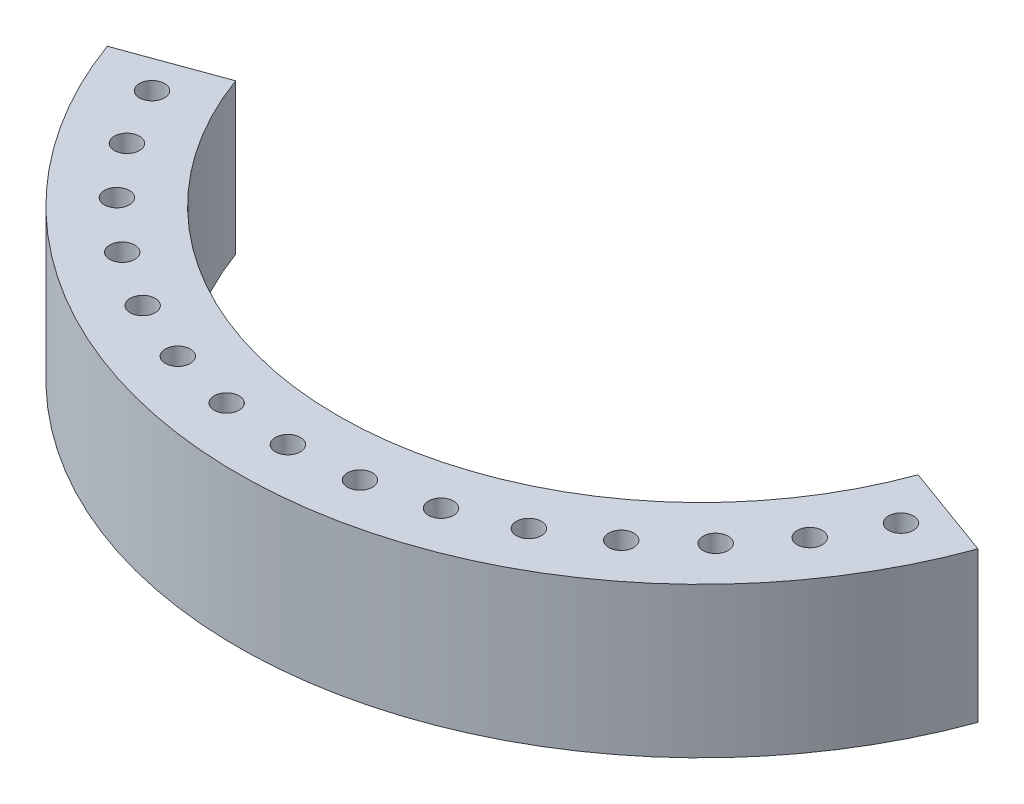
ISO-10303-21;
HEADER;
FILE_DESCRIPTION(('STEP AP214'),'2;1');
FILE_NAME('part.step','',(''),(''),'','','');
FILE_SCHEMA(('AUTOMOTIVE_DESIGN { 1 0 10303 214 1 1 1 1 }'));
ENDSEC;
DATA;
#1=APPLICATION_CONTEXT('core data for automotive mechanical design processes');
#2=APPLICATION_PROTOCOL_DEFINITION('international standard','automotive_design',2000,#1);
#3=PRODUCT_CONTEXT('',#1,'mechanical');
#4=PRODUCT('Part','Part','',(#3));
#5=PRODUCT_RELATED_PRODUCT_CATEGORY('part','',(#4));
#6=PRODUCT_DEFINITION_FORMATION('','',#4);
#7=PRODUCT_DEFINITION_CONTEXT('part definition',#1,'design');
#8=PRODUCT_DEFINITION('design','',#6,#7);
#9=PRODUCT_DEFINITION_SHAPE('','',#8);
#10=(LENGTH_UNIT() NAMED_UNIT(*) SI_UNIT(.MILLI.,.METRE.));
#11=(NAMED_UNIT(*) PLANE_ANGLE_UNIT() SI_UNIT($,.RADIAN.));
#12=(NAMED_UNIT(*) SI_UNIT($,.STERADIAN.) SOLID_ANGLE_UNIT());
#13=UNCERTAINTY_MEASURE_WITH_UNIT(LENGTH_MEASURE(1.E-05),#10,'distance_accuracy_value','');
#14=(GEOMETRIC_REPRESENTATION_CONTEXT(3) GLOBAL_UNCERTAINTY_ASSIGNED_CONTEXT((#13)) GLOBAL_UNIT_ASSIGNED_CONTEXT((#10,
#11,#12)) REPRESENTATION_CONTEXT('',''));
#15=CARTESIAN_POINT('',(0.,0.,0.));
#16=DIRECTION('',(0.,0.,1.));
#17=DIRECTION('',(1.,0.,0.));
#18=AXIS2_PLACEMENT_3D('',#15,#16,#17);
#19=CARTESIAN_POINT('',(0.,-38.1,0.));
#20=DIRECTION('',(0.,1.,0.));
#21=DIRECTION('',(0.,0.,1.));
#22=AXIS2_PLACEMENT_3D('',#19,#20,#21);
#23=CYLINDRICAL_SURFACE('',#22,117.475);
#24=CARTESIAN_POINT('',(0.,0.,0.));
#25=DIRECTION('',(0.,1.,0.));
#26=DIRECTION('',(0.,0.,1.));
#27=AXIS2_PLACEMENT_3D('',#24,#25,#26);
#28=CIRCLE('',#27,117.475);
#29=CARTESIAN_POINT('',(-110.390390626825,0.,40.178816337183));
#30=VERTEX_POINT('',#29);
#31=CARTESIAN_POINT('',(110.390390626825,0.,40.178816337183));
#32=VERTEX_POINT('',#31);
#33=EDGE_CURVE('E98',#30,#32,#28,.T.);
#34=ORIENTED_EDGE('',*,*,#33,.F.);
#35=DIRECTION('',(0.,1.,0.));
#36=VECTOR('',#35,1.);
#37=CARTESIAN_POINT('',(-110.390390626825,-38.1,40.178816337183));
#38=LINE('',#37,#36);
#39=CARTESIAN_POINT('',(-110.390390626825,-38.1,40.178816337183));
#40=VERTEX_POINT('',#39);
#41=EDGE_CURVE('E11',#40,#30,#38,.T.);
#42=ORIENTED_EDGE('',*,*,#41,.F.);
#43=CARTESIAN_POINT('',(0.,-38.1,0.));
#44=DIRECTION('',(0.,1.,0.));
#45=DIRECTION('',(0.,0.,1.));
#46=AXIS2_PLACEMENT_3D('',#43,#44,#45);
#47=CIRCLE('',#46,117.475);
#48=CARTESIAN_POINT('',(110.390390626825,-38.1,40.178816337183));
#49=VERTEX_POINT('',#48);
#50=EDGE_CURVE('E91',#40,#49,#47,.T.);
#51=ORIENTED_EDGE('',*,*,#50,.T.);
#52=DIRECTION('',(0.,1.,0.));
#53=VECTOR('',#52,1.);
#54=CARTESIAN_POINT('',(110.390390626825,-38.1,40.178816337183));
#55=LINE('',#54,#53);
#56=EDGE_CURVE('E36',#49,#32,#55,.T.);
#57=ORIENTED_EDGE('',*,*,#56,.T.);
#58=EDGE_LOOP('',(#34,#42,#51,#57));
#59=FACE_BOUND('',#58,.T.);
#60=ADVANCED_FACE('F33',(#59),#23,.T.);
#61=CARTESIAN_POINT('',(-110.390390626825,-38.1,40.178816337183));
#62=DIRECTION('',(-0.342020143325669,0.,-0.939692620785908));
#63=DIRECTION('',(-0.939692620785908,0.,0.342020143325669));
#64=AXIS2_PLACEMENT_3D('',#61,#62,#63);
#65=PLANE('',#64);
#66=DIRECTION('',(-0.939692620785908,0.,0.342020143325669));
#67=VECTOR('',#66,1.);
#68=CARTESIAN_POINT('',(-110.390390626825,0.,40.178816337183));
#69=LINE('',#68,#67);
#70=CARTESIAN_POINT('',(-86.5221980588625,0.,31.491504696711));
#71=VERTEX_POINT('',#70);
#72=EDGE_CURVE('E93',#71,#30,#69,.T.);
#73=ORIENTED_EDGE('',*,*,#72,.F.);
#74=DIRECTION('',(0.,1.,0.));
#75=VECTOR('',#74,1.);
#76=CARTESIAN_POINT('',(-86.5221980588625,-38.1,31.491504696711));
#77=LINE('',#76,#75);
#78=CARTESIAN_POINT('',(-86.5221980588625,-38.1,31.491504696711));
#79=VERTEX_POINT('',#78);
#80=EDGE_CURVE('E42',#79,#71,#77,.T.);
#81=ORIENTED_EDGE('',*,*,#80,.F.);
#82=DIRECTION('',(-0.939692620785908,0.,0.342020143325669));
#83=VECTOR('',#82,1.);
#84=CARTESIAN_POINT('',(-110.390390626825,-38.1,40.178816337183));
#85=LINE('',#84,#83);
#86=EDGE_CURVE('E88',#79,#40,#85,.T.);
#87=ORIENTED_EDGE('',*,*,#86,.T.);
#88=ORIENTED_EDGE('',*,*,#41,.T.);
#89=EDGE_LOOP('',(#73,#81,#87,#88));
#90=FACE_BOUND('',#89,.T.);
#91=ADVANCED_FACE('F109',(#90),#65,.T.);
#92=CARTESIAN_POINT('',(0.,-38.1,0.));
#93=DIRECTION('',(0.,1.,0.));
#94=DIRECTION('',(0.,0.,1.));
#95=AXIS2_PLACEMENT_3D('',#92,#93,#94);
#96=CYLINDRICAL_SURFACE('',#95,92.075);
#97=CARTESIAN_POINT('',(0.,0.,0.));
#98=DIRECTION('',(0.,-1.,0.));
#99=DIRECTION('',(0.,0.,1.));
#100=AXIS2_PLACEMENT_3D('',#97,#98,#99);
#101=CIRCLE('',#100,92.075);
#102=CARTESIAN_POINT('',(86.5221980588625,0.,31.491504696711));
#103=VERTEX_POINT('',#102);
#104=EDGE_CURVE('E83',#103,#71,#101,.T.);
#105=ORIENTED_EDGE('',*,*,#104,.F.);
#106=DIRECTION('',(0.,1.,0.));
#107=VECTOR('',#106,1.);
#108=CARTESIAN_POINT('',(86.5221980588625,-38.1,31.491504696711));
#109=LINE('',#108,#107);
#110=CARTESIAN_POINT('',(86.5221980588625,-38.1,31.491504696711));
#111=VERTEX_POINT('',#110);
#112=EDGE_CURVE('E78',#111,#103,#109,.T.);
#113=ORIENTED_EDGE('',*,*,#112,.F.);
#114=CARTESIAN_POINT('',(0.,-38.1,0.));
#115=DIRECTION('',(0.,-1.,0.));
#116=DIRECTION('',(0.,0.,1.));
#117=AXIS2_PLACEMENT_3D('',#114,#115,#116);
#118=CIRCLE('',#117,92.075);
#119=EDGE_CURVE('E81',#111,#79,#118,.T.);
#120=ORIENTED_EDGE('',*,*,#119,.T.);
#121=ORIENTED_EDGE('',*,*,#80,.T.);
#122=EDGE_LOOP('',(#105,#113,#120,#121));
#123=FACE_BOUND('',#122,.T.);
#124=ADVANCED_FACE('F80',(#123),#96,.F.);
#125=CARTESIAN_POINT('',(86.5221980588625,-38.1,31.491504696711));
#126=DIRECTION('',(0.34202014332567,0.,-0.939692620785908));
#127=DIRECTION('',(-0.939692620785908,0.,-0.34202014332567));
#128=AXIS2_PLACEMENT_3D('',#125,#126,#127);
#129=PLANE('',#128);
#130=DIRECTION('',(-0.939692620785908,0.,-0.34202014332567));
#131=VECTOR('',#130,1.);
#132=CARTESIAN_POINT('',(86.5221980588625,0.,31.491504696711));
#133=LINE('',#132,#131);
#134=EDGE_CURVE('E101',#32,#103,#133,.T.);
#135=ORIENTED_EDGE('',*,*,#134,.F.);
#136=ORIENTED_EDGE('',*,*,#56,.F.);
#137=DIRECTION('',(-0.939692620785908,0.,-0.34202014332567));
#138=VECTOR('',#137,1.);
#139=CARTESIAN_POINT('',(86.5221980588625,-38.1,31.491504696711));
#140=LINE('',#139,#138);
#141=EDGE_CURVE('E87',#49,#111,#140,.T.);
#142=ORIENTED_EDGE('',*,*,#141,.T.);
#143=ORIENTED_EDGE('',*,*,#112,.T.);
#144=EDGE_LOOP('',(#135,#136,#142,#143));
#145=FACE_BOUND('',#144,.T.);
#146=ADVANCED_FACE('F90',(#145),#129,.T.);
#147=CARTESIAN_POINT('',(0.,-38.1,0.));
#148=DIRECTION('',(0.,1.,0.));
#149=DIRECTION('',(0.,0.,1.));
#150=AXIS2_PLACEMENT_3D('',#147,#148,#149);
#151=PLANE('',#150);
#152=CARTESIAN_POINT('',(94.9583983867651,-38.1,44.2798283738815));
#153=DIRECTION('',(0.,1.,0.));
#154=DIRECTION('',(0.,0.,1.));
#155=AXIS2_PLACEMENT_3D('',#152,#153,#154);
#156=CIRCLE('',#155,3.175);
#157=CARTESIAN_POINT('',(94.9583983867651,-38.1,47.4548283738815));
#158=VERTEX_POINT('',#157);
#159=EDGE_CURVE('E194',#158,#158,#156,.T.);
#160=ORIENTED_EDGE('',*,*,#159,.T.);
#161=EDGE_LOOP('',(#160));
#162=FACE_BOUND('',#161,.T.);
#163=CARTESIAN_POINT('',(86.5691675789585,-38.1,59.0218590836158));
#164=DIRECTION('',(0.,1.,0.));
#165=DIRECTION('',(0.,0.,1.));
#166=AXIS2_PLACEMENT_3D('',#163,#164,#165);
#167=CIRCLE('',#166,3.175);
#168=CARTESIAN_POINT('',(86.5691675789585,-38.1,62.1968590836158));
#169=VERTEX_POINT('',#168);
#170=EDGE_CURVE('E204',#169,#169,#167,.T.);
#171=ORIENTED_EDGE('',*,*,#170,.T.);
#172=EDGE_LOOP('',(#171));
#173=FACE_BOUND('',#172,.T.);
#174=CARTESIAN_POINT('',(75.9111283665304,-38.1,72.2170424146554));
#175=DIRECTION('',(0.,1.,0.));
#176=DIRECTION('',(0.,0.,1.));
#177=AXIS2_PLACEMENT_3D('',#174,#175,#176);
#178=CIRCLE('',#177,3.175);
#179=CARTESIAN_POINT('',(75.9111283665304,-38.1,75.3920424146554));
#180=VERTEX_POINT('',#179);
#181=EDGE_CURVE('E210',#180,#180,#178,.T.);
#182=ORIENTED_EDGE('',*,*,#181,.T.);
#183=EDGE_LOOP('',(#182));
#184=FACE_BOUND('',#183,.T.);
#185=CARTESIAN_POINT('',(63.263607091852,-38.1,83.5195584442816));
#186=DIRECTION('',(0.,1.,0.));
#187=DIRECTION('',(0.,0.,1.));
#188=AXIS2_PLACEMENT_3D('',#185,#186,#187);
#189=CIRCLE('',#188,3.175);
#190=CARTESIAN_POINT('',(63.263607091852,-38.1,86.6945584442816));
#191=VERTEX_POINT('',#190);
#192=EDGE_CURVE('E216',#191,#191,#189,.T.);
#193=ORIENTED_EDGE('',*,*,#192,.T.);
#194=EDGE_LOOP('',(#193));
#195=FACE_BOUND('',#194,.T.);
#196=CARTESIAN_POINT('',(48.9580705273102,-38.1,92.6331903544454));
#197=DIRECTION('',(0.,1.,0.));
#198=DIRECTION('',(0.,0.,1.));
#199=AXIS2_PLACEMENT_3D('',#196,#197,#198);
#200=CIRCLE('',#199,3.17499999999999);
#201=CARTESIAN_POINT('',(48.9580705273102,-38.1,95.8081903544454));
#202=VERTEX_POINT('',#201);
#203=EDGE_CURVE('E222',#202,#202,#200,.T.);
#204=ORIENTED_EDGE('',*,*,#203,.T.);
#205=EDGE_LOOP('',(#204));
#206=FACE_BOUND('',#205,.T.);
#207=CARTESIAN_POINT('',(33.3694387801203,-38.1,99.3190876946612));
#208=DIRECTION('',(0.,1.,0.));
#209=DIRECTION('',(0.,0.,1.));
#210=AXIS2_PLACEMENT_3D('',#207,#208,#209);
#211=CIRCLE('',#210,3.17499999999999);
#212=CARTESIAN_POINT('',(33.3694387801203,-38.1,102.494087694661));
#213=VERTEX_POINT('',#212);
#214=EDGE_CURVE('E228',#213,#213,#211,.T.);
#215=ORIENTED_EDGE('',*,*,#214,.T.);
#216=EDGE_LOOP('',(#215));
#217=FACE_BOUND('',#216,.T.);
#218=CARTESIAN_POINT('',(16.9062593703024,-38.1,103.402026184713));
#219=DIRECTION('',(0.,1.,0.));
#220=DIRECTION('',(0.,0.,1.));
#221=AXIS2_PLACEMENT_3D('',#218,#219,#220);
#222=CIRCLE('',#221,3.175);
#223=CARTESIAN_POINT('',(16.9062593703024,-38.1,106.577026184713));
#224=VERTEX_POINT('',#223);
#225=EDGE_CURVE('E234',#224,#224,#222,.T.);
#226=ORIENTED_EDGE('',*,*,#225,.T.);
#227=EDGE_LOOP('',(#226));
#228=FACE_BOUND('',#227,.T.);
#229=CARTESIAN_POINT('',(-94.9583983867651,-38.1,44.2798283738815));
#230=DIRECTION('',(0.,1.,0.));
#231=DIRECTION('',(0.,0.,1.));
#232=AXIS2_PLACEMENT_3D('',#229,#230,#231);
#233=CIRCLE('',#232,3.175);
#234=CARTESIAN_POINT('',(-94.9583983867651,-38.1,47.4548283738815));
#235=VERTEX_POINT('',#234);
#236=EDGE_CURVE('E240',#235,#235,#233,.T.);
#237=ORIENTED_EDGE('',*,*,#236,.T.);
#238=EDGE_LOOP('',(#237));
#239=FACE_BOUND('',#238,.T.);
#240=CARTESIAN_POINT('',(-86.5691675789585,-38.1,59.0218590836158));
#241=DIRECTION('',(0.,1.,0.));
#242=DIRECTION('',(0.,0.,1.));
#243=AXIS2_PLACEMENT_3D('',#240,#241,#242);
#244=CIRCLE('',#243,3.175);
#245=CARTESIAN_POINT('',(-86.5691675789585,-38.1,62.1968590836158));
#246=VERTEX_POINT('',#245);
#247=EDGE_CURVE('E246',#246,#246,#244,.T.);
#248=ORIENTED_EDGE('',*,*,#247,.T.);
#249=EDGE_LOOP('',(#248));
#250=FACE_BOUND('',#249,.T.);
#251=CARTESIAN_POINT('',(-75.9111283665304,-38.1,72.2170424146554));
#252=DIRECTION('',(0.,1.,0.));
#253=DIRECTION('',(0.,0.,1.));
#254=AXIS2_PLACEMENT_3D('',#251,#252,#253);
#255=CIRCLE('',#254,3.175);
#256=CARTESIAN_POINT('',(-75.9111283665304,-38.1,75.3920424146554));
#257=VERTEX_POINT('',#256);
#258=EDGE_CURVE('E252',#257,#257,#255,.T.);
#259=ORIENTED_EDGE('',*,*,#258,.T.);
#260=EDGE_LOOP('',(#259));
#261=FACE_BOUND('',#260,.T.);
#262=CARTESIAN_POINT('',(-63.263607091852,-38.1,83.5195584442816));
#263=DIRECTION('',(0.,1.,0.));
#264=DIRECTION('',(0.,0.,1.));
#265=AXIS2_PLACEMENT_3D('',#262,#263,#264);
#266=CIRCLE('',#265,3.17499999999999);
#267=CARTESIAN_POINT('',(-63.263607091852,-38.1,86.6945584442816));
#268=VERTEX_POINT('',#267);
#269=EDGE_CURVE('E258',#268,#268,#266,.T.);
#270=ORIENTED_EDGE('',*,*,#269,.T.);
#271=EDGE_LOOP('',(#270));
#272=FACE_BOUND('',#271,.T.);
#273=CARTESIAN_POINT('',(-48.9580705273102,-38.1,92.6331903544454));
#274=DIRECTION('',(0.,1.,0.));
#275=DIRECTION('',(0.,0.,1.));
#276=AXIS2_PLACEMENT_3D('',#273,#274,#275);
#277=CIRCLE('',#276,3.17499999999999);
#278=CARTESIAN_POINT('',(-48.9580705273102,-38.1,95.8081903544454));
#279=VERTEX_POINT('',#278);
#280=EDGE_CURVE('E264',#279,#279,#277,.T.);
#281=ORIENTED_EDGE('',*,*,#280,.T.);
#282=EDGE_LOOP('',(#281));
#283=FACE_BOUND('',#282,.T.);
#284=CARTESIAN_POINT('',(-33.3694387801203,-38.1,99.3190876946612));
#285=DIRECTION('',(0.,1.,0.));
#286=DIRECTION('',(0.,0.,1.));
#287=AXIS2_PLACEMENT_3D('',#284,#285,#286);
#288=CIRCLE('',#287,3.175);
#289=CARTESIAN_POINT('',(-33.3694387801203,-38.1,102.494087694661));
#290=VERTEX_POINT('',#289);
#291=EDGE_CURVE('E270',#290,#290,#288,.T.);
#292=ORIENTED_EDGE('',*,*,#291,.T.);
#293=EDGE_LOOP('',(#292));
#294=FACE_BOUND('',#293,.T.);
#295=CARTESIAN_POINT('',(-16.9062593703024,-38.1,103.402026184713));
#296=DIRECTION('',(0.,1.,0.));
#297=DIRECTION('',(0.,0.,1.));
#298=AXIS2_PLACEMENT_3D('',#295,#296,#297);
#299=CIRCLE('',#298,3.175);
#300=CARTESIAN_POINT('',(-16.9062593703024,-38.1,106.577026184713));
#301=VERTEX_POINT('',#300);
#302=EDGE_CURVE('E276',#301,#301,#299,.T.);
#303=ORIENTED_EDGE('',*,*,#302,.T.);
#304=EDGE_LOOP('',(#303));
#305=FACE_BOUND('',#304,.T.);
#306=CARTESIAN_POINT('',(0.,-38.1,104.775));
#307=DIRECTION('',(0.,1.,0.));
#308=DIRECTION('',(0.,0.,1.));
#309=AXIS2_PLACEMENT_3D('',#306,#307,#308);
#310=CIRCLE('',#309,3.175);
#311=CARTESIAN_POINT('',(0.,-38.1,107.95));
#312=VERTEX_POINT('',#311);
#313=EDGE_CURVE('E102',#312,#312,#310,.T.);
#314=ORIENTED_EDGE('',*,*,#313,.T.);
#315=EDGE_LOOP('',(#314));
#316=FACE_BOUND('',#315,.T.);
#317=ORIENTED_EDGE('',*,*,#50,.F.);
#318=ORIENTED_EDGE('',*,*,#86,.F.);
#319=ORIENTED_EDGE('',*,*,#119,.F.);
#320=ORIENTED_EDGE('',*,*,#141,.F.);
#321=EDGE_LOOP('',(#317,#318,#319,#320));
#322=FACE_BOUND('',#321,.T.);
#323=ADVANCED_FACE('F86',(#162,#173,#184,#195,#206,#217,#228,#239,#250,#261,#272,#283,#294,#305,
#316,#322),#151,.F.);
#324=CARTESIAN_POINT('',(0.,0.,0.));
#325=DIRECTION('',(0.,1.,0.));
#326=DIRECTION('',(0.,0.,1.));
#327=AXIS2_PLACEMENT_3D('',#324,#325,#326);
#328=PLANE('',#327);
#329=CARTESIAN_POINT('',(94.9583983867651,0.,44.2798283738815));
#330=DIRECTION('',(0.,1.,0.));
#331=DIRECTION('',(0.,0.,1.));
#332=AXIS2_PLACEMENT_3D('',#329,#330,#331);
#333=CIRCLE('',#332,3.175);
#334=CARTESIAN_POINT('',(94.9583983867651,0.,47.4548283738815));
#335=VERTEX_POINT('',#334);
#336=EDGE_CURVE('E197',#335,#335,#333,.T.);
#337=ORIENTED_EDGE('',*,*,#336,.F.);
#338=EDGE_LOOP('',(#337));
#339=FACE_BOUND('',#338,.T.);
#340=CARTESIAN_POINT('',(86.5691675789585,0.,59.0218590836158));
#341=DIRECTION('',(0.,1.,0.));
#342=DIRECTION('',(0.,0.,1.));
#343=AXIS2_PLACEMENT_3D('',#340,#341,#342);
#344=CIRCLE('',#343,3.175);
#345=CARTESIAN_POINT('',(86.5691675789585,0.,62.1968590836158));
#346=VERTEX_POINT('',#345);
#347=EDGE_CURVE('E199',#346,#346,#344,.T.);
#348=ORIENTED_EDGE('',*,*,#347,.F.);
#349=EDGE_LOOP('',(#348));
#350=FACE_BOUND('',#349,.T.);
#351=CARTESIAN_POINT('',(75.9111283665304,0.,72.2170424146554));
#352=DIRECTION('',(0.,1.,0.));
#353=DIRECTION('',(0.,0.,1.));
#354=AXIS2_PLACEMENT_3D('',#351,#352,#353);
#355=CIRCLE('',#354,3.175);
#356=CARTESIAN_POINT('',(75.9111283665304,0.,75.3920424146554));
#357=VERTEX_POINT('',#356);
#358=EDGE_CURVE('E207',#357,#357,#355,.T.);
#359=ORIENTED_EDGE('',*,*,#358,.F.);
#360=EDGE_LOOP('',(#359));
#361=FACE_BOUND('',#360,.T.);
#362=CARTESIAN_POINT('',(63.263607091852,0.,83.5195584442816));
#363=DIRECTION('',(0.,1.,0.));
#364=DIRECTION('',(0.,0.,1.));
#365=AXIS2_PLACEMENT_3D('',#362,#363,#364);
#366=CIRCLE('',#365,3.175);
#367=CARTESIAN_POINT('',(63.263607091852,0.,86.6945584442816));
#368=VERTEX_POINT('',#367);
#369=EDGE_CURVE('E213',#368,#368,#366,.T.);
#370=ORIENTED_EDGE('',*,*,#369,.F.);
#371=EDGE_LOOP('',(#370));
#372=FACE_BOUND('',#371,.T.);
#373=CARTESIAN_POINT('',(48.9580705273102,0.,92.6331903544454));
#374=DIRECTION('',(0.,1.,0.));
#375=DIRECTION('',(0.,0.,1.));
#376=AXIS2_PLACEMENT_3D('',#373,#374,#375);
#377=CIRCLE('',#376,3.175);
#378=CARTESIAN_POINT('',(48.9580705273102,0.,95.8081903544454));
#379=VERTEX_POINT('',#378);
#380=EDGE_CURVE('E219',#379,#379,#377,.T.);
#381=ORIENTED_EDGE('',*,*,#380,.F.);
#382=EDGE_LOOP('',(#381));
#383=FACE_BOUND('',#382,.T.);
#384=CARTESIAN_POINT('',(33.3694387801203,0.,99.3190876946612));
#385=DIRECTION('',(0.,1.,0.));
#386=DIRECTION('',(0.,0.,1.));
#387=AXIS2_PLACEMENT_3D('',#384,#385,#386);
#388=CIRCLE('',#387,3.175);
#389=CARTESIAN_POINT('',(33.3694387801203,0.,102.494087694661));
#390=VERTEX_POINT('',#389);
#391=EDGE_CURVE('E225',#390,#390,#388,.T.);
#392=ORIENTED_EDGE('',*,*,#391,.F.);
#393=EDGE_LOOP('',(#392));
#394=FACE_BOUND('',#393,.T.);
#395=CARTESIAN_POINT('',(16.9062593703024,0.,103.402026184713));
#396=DIRECTION('',(0.,1.,0.));
#397=DIRECTION('',(0.,0.,1.));
#398=AXIS2_PLACEMENT_3D('',#395,#396,#397);
#399=CIRCLE('',#398,3.175);
#400=CARTESIAN_POINT('',(16.9062593703024,0.,106.577026184713));
#401=VERTEX_POINT('',#400);
#402=EDGE_CURVE('E231',#401,#401,#399,.T.);
#403=ORIENTED_EDGE('',*,*,#402,.F.);
#404=EDGE_LOOP('',(#403));
#405=FACE_BOUND('',#404,.T.);
#406=CARTESIAN_POINT('',(-94.9583983867651,0.,44.2798283738815));
#407=DIRECTION('',(0.,1.,0.));
#408=DIRECTION('',(0.,0.,1.));
#409=AXIS2_PLACEMENT_3D('',#406,#407,#408);
#410=CIRCLE('',#409,3.175);
#411=CARTESIAN_POINT('',(-94.9583983867651,0.,47.4548283738815));
#412=VERTEX_POINT('',#411);
#413=EDGE_CURVE('E237',#412,#412,#410,.T.);
#414=ORIENTED_EDGE('',*,*,#413,.F.);
#415=EDGE_LOOP('',(#414));
#416=FACE_BOUND('',#415,.T.);
#417=CARTESIAN_POINT('',(-86.5691675789585,0.,59.0218590836158));
#418=DIRECTION('',(0.,1.,0.));
#419=DIRECTION('',(0.,0.,1.));
#420=AXIS2_PLACEMENT_3D('',#417,#418,#419);
#421=CIRCLE('',#420,3.175);
#422=CARTESIAN_POINT('',(-86.5691675789585,0.,62.1968590836158));
#423=VERTEX_POINT('',#422);
#424=EDGE_CURVE('E243',#423,#423,#421,.T.);
#425=ORIENTED_EDGE('',*,*,#424,.F.);
#426=EDGE_LOOP('',(#425));
#427=FACE_BOUND('',#426,.T.);
#428=CARTESIAN_POINT('',(-75.9111283665304,0.,72.2170424146554));
#429=DIRECTION('',(0.,1.,0.));
#430=DIRECTION('',(0.,0.,1.));
#431=AXIS2_PLACEMENT_3D('',#428,#429,#430);
#432=CIRCLE('',#431,3.175);
#433=CARTESIAN_POINT('',(-75.9111283665304,0.,75.3920424146554));
#434=VERTEX_POINT('',#433);
#435=EDGE_CURVE('E249',#434,#434,#432,.T.);
#436=ORIENTED_EDGE('',*,*,#435,.F.);
#437=EDGE_LOOP('',(#436));
#438=FACE_BOUND('',#437,.T.);
#439=CARTESIAN_POINT('',(-63.263607091852,0.,83.5195584442816));
#440=DIRECTION('',(0.,1.,0.));
#441=DIRECTION('',(0.,0.,1.));
#442=AXIS2_PLACEMENT_3D('',#439,#440,#441);
#443=CIRCLE('',#442,3.175);
#444=CARTESIAN_POINT('',(-63.263607091852,0.,86.6945584442816));
#445=VERTEX_POINT('',#444);
#446=EDGE_CURVE('E255',#445,#445,#443,.T.);
#447=ORIENTED_EDGE('',*,*,#446,.F.);
#448=EDGE_LOOP('',(#447));
#449=FACE_BOUND('',#448,.T.);
#450=CARTESIAN_POINT('',(-48.9580705273102,0.,92.6331903544454));
#451=DIRECTION('',(0.,1.,0.));
#452=DIRECTION('',(0.,0.,1.));
#453=AXIS2_PLACEMENT_3D('',#450,#451,#452);
#454=CIRCLE('',#453,3.175);
#455=CARTESIAN_POINT('',(-48.9580705273102,0.,95.8081903544454));
#456=VERTEX_POINT('',#455);
#457=EDGE_CURVE('E261',#456,#456,#454,.T.);
#458=ORIENTED_EDGE('',*,*,#457,.F.);
#459=EDGE_LOOP('',(#458));
#460=FACE_BOUND('',#459,.T.);
#461=CARTESIAN_POINT('',(-33.3694387801203,0.,99.3190876946612));
#462=DIRECTION('',(0.,1.,0.));
#463=DIRECTION('',(0.,0.,1.));
#464=AXIS2_PLACEMENT_3D('',#461,#462,#463);
#465=CIRCLE('',#464,3.175);
#466=CARTESIAN_POINT('',(-33.3694387801203,0.,102.494087694661));
#467=VERTEX_POINT('',#466);
#468=EDGE_CURVE('E267',#467,#467,#465,.T.);
#469=ORIENTED_EDGE('',*,*,#468,.F.);
#470=EDGE_LOOP('',(#469));
#471=FACE_BOUND('',#470,.T.);
#472=CARTESIAN_POINT('',(-16.9062593703024,0.,103.402026184713));
#473=DIRECTION('',(0.,1.,0.));
#474=DIRECTION('',(0.,0.,1.));
#475=AXIS2_PLACEMENT_3D('',#472,#473,#474);
#476=CIRCLE('',#475,3.175);
#477=CARTESIAN_POINT('',(-16.9062593703024,0.,106.577026184713));
#478=VERTEX_POINT('',#477);
#479=EDGE_CURVE('E273',#478,#478,#476,.T.);
#480=ORIENTED_EDGE('',*,*,#479,.F.);
#481=EDGE_LOOP('',(#480));
#482=FACE_BOUND('',#481,.T.);
#483=CARTESIAN_POINT('',(0.,0.,104.775));
#484=DIRECTION('',(0.,1.,0.));
#485=DIRECTION('',(0.,0.,1.));
#486=AXIS2_PLACEMENT_3D('',#483,#484,#485);
#487=CIRCLE('',#486,3.175);
#488=CARTESIAN_POINT('',(0.,0.,107.95));
#489=VERTEX_POINT('',#488);
#490=EDGE_CURVE('E279',#489,#489,#487,.T.);
#491=ORIENTED_EDGE('',*,*,#490,.F.);
#492=EDGE_LOOP('',(#491));
#493=FACE_BOUND('',#492,.T.);
#494=ORIENTED_EDGE('',*,*,#33,.T.);
#495=ORIENTED_EDGE('',*,*,#134,.T.);
#496=ORIENTED_EDGE('',*,*,#104,.T.);
#497=ORIENTED_EDGE('',*,*,#72,.T.);
#498=EDGE_LOOP('',(#494,#495,#496,#497));
#499=FACE_BOUND('',#498,.T.);
#500=ADVANCED_FACE('F108',(#339,#350,#361,#372,#383,#394,#405,#416,#427,#438,#449,#460,#471,
#482,#493,#499),#328,.T.);
#501=CARTESIAN_POINT('',(0.,0.,104.775));
#502=DIRECTION('',(0.,1.,0.));
#503=DIRECTION('',(0.,0.,1.));
#504=AXIS2_PLACEMENT_3D('',#501,#502,#503);
#505=CYLINDRICAL_SURFACE('',#504,3.175);
#506=ORIENTED_EDGE('',*,*,#313,.F.);
#507=EDGE_LOOP('',(#506));
#508=FACE_BOUND('',#507,.T.);
#509=ORIENTED_EDGE('',*,*,#490,.T.);
#510=EDGE_LOOP('',(#509));
#511=FACE_BOUND('',#510,.T.);
#512=ADVANCED_FACE('F127',(#508,#511),#505,.F.);
#513=CARTESIAN_POINT('',(-16.9062593703024,0.,103.402026184713));
#514=DIRECTION('',(0.,1.,0.));
#515=DIRECTION('',(0.,0.,1.));
#516=AXIS2_PLACEMENT_3D('',#513,#514,#515);
#517=CYLINDRICAL_SURFACE('',#516,3.175);
#518=ORIENTED_EDGE('',*,*,#302,.F.);
#519=EDGE_LOOP('',(#518));
#520=FACE_BOUND('',#519,.T.);
#521=ORIENTED_EDGE('',*,*,#479,.T.);
#522=EDGE_LOOP('',(#521));
#523=FACE_BOUND('',#522,.T.);
#524=ADVANCED_FACE('F134',(#520,#523),#517,.F.);
#525=CARTESIAN_POINT('',(-33.3694387801203,0.,99.3190876946612));
#526=DIRECTION('',(0.,1.,0.));
#527=DIRECTION('',(0.,0.,1.));
#528=AXIS2_PLACEMENT_3D('',#525,#526,#527);
#529=CYLINDRICAL_SURFACE('',#528,3.175);
#530=ORIENTED_EDGE('',*,*,#291,.F.);
#531=EDGE_LOOP('',(#530));
#532=FACE_BOUND('',#531,.T.);
#533=ORIENTED_EDGE('',*,*,#468,.T.);
#534=EDGE_LOOP('',(#533));
#535=FACE_BOUND('',#534,.T.);
#536=ADVANCED_FACE('F138',(#532,#535),#529,.F.);
#537=CARTESIAN_POINT('',(-48.9580705273102,0.,92.6331903544454));
#538=DIRECTION('',(0.,1.,0.));
#539=DIRECTION('',(0.,0.,1.));
#540=AXIS2_PLACEMENT_3D('',#537,#538,#539);
#541=CYLINDRICAL_SURFACE('',#540,3.17499999999999);
#542=ORIENTED_EDGE('',*,*,#280,.F.);
#543=EDGE_LOOP('',(#542));
#544=FACE_BOUND('',#543,.T.);
#545=ORIENTED_EDGE('',*,*,#457,.T.);
#546=EDGE_LOOP('',(#545));
#547=FACE_BOUND('',#546,.T.);
#548=ADVANCED_FACE('F142',(#544,#547),#541,.F.);
#549=CARTESIAN_POINT('',(-63.263607091852,0.,83.5195584442816));
#550=DIRECTION('',(0.,1.,0.));
#551=DIRECTION('',(0.,0.,1.));
#552=AXIS2_PLACEMENT_3D('',#549,#550,#551);
#553=CYLINDRICAL_SURFACE('',#552,3.17499999999999);
#554=ORIENTED_EDGE('',*,*,#269,.F.);
#555=EDGE_LOOP('',(#554));
#556=FACE_BOUND('',#555,.T.);
#557=ORIENTED_EDGE('',*,*,#446,.T.);
#558=EDGE_LOOP('',(#557));
#559=FACE_BOUND('',#558,.T.);
#560=ADVANCED_FACE('F146',(#556,#559),#553,.F.);
#561=CARTESIAN_POINT('',(-75.9111283665304,0.,72.2170424146554));
#562=DIRECTION('',(0.,1.,0.));
#563=DIRECTION('',(0.,0.,1.));
#564=AXIS2_PLACEMENT_3D('',#561,#562,#563);
#565=CYLINDRICAL_SURFACE('',#564,3.175);
#566=ORIENTED_EDGE('',*,*,#258,.F.);
#567=EDGE_LOOP('',(#566));
#568=FACE_BOUND('',#567,.T.);
#569=ORIENTED_EDGE('',*,*,#435,.T.);
#570=EDGE_LOOP('',(#569));
#571=FACE_BOUND('',#570,.T.);
#572=ADVANCED_FACE('F150',(#568,#571),#565,.F.);
#573=CARTESIAN_POINT('',(-86.5691675789585,0.,59.0218590836158));
#574=DIRECTION('',(0.,1.,0.));
#575=DIRECTION('',(0.,0.,1.));
#576=AXIS2_PLACEMENT_3D('',#573,#574,#575);
#577=CYLINDRICAL_SURFACE('',#576,3.175);
#578=ORIENTED_EDGE('',*,*,#247,.F.);
#579=EDGE_LOOP('',(#578));
#580=FACE_BOUND('',#579,.T.);
#581=ORIENTED_EDGE('',*,*,#424,.T.);
#582=EDGE_LOOP('',(#581));
#583=FACE_BOUND('',#582,.T.);
#584=ADVANCED_FACE('F154',(#580,#583),#577,.F.);
#585=CARTESIAN_POINT('',(-94.9583983867651,0.,44.2798283738815));
#586=DIRECTION('',(0.,1.,0.));
#587=DIRECTION('',(0.,0.,1.));
#588=AXIS2_PLACEMENT_3D('',#585,#586,#587);
#589=CYLINDRICAL_SURFACE('',#588,3.175);
#590=ORIENTED_EDGE('',*,*,#236,.F.);
#591=EDGE_LOOP('',(#590));
#592=FACE_BOUND('',#591,.T.);
#593=ORIENTED_EDGE('',*,*,#413,.T.);
#594=EDGE_LOOP('',(#593));
#595=FACE_BOUND('',#594,.T.);
#596=ADVANCED_FACE('F158',(#592,#595),#589,.F.);
#597=CARTESIAN_POINT('',(16.9062593703024,0.,103.402026184713));
#598=DIRECTION('',(0.,1.,0.));
#599=DIRECTION('',(0.,0.,1.));
#600=AXIS2_PLACEMENT_3D('',#597,#598,#599);
#601=CYLINDRICAL_SURFACE('',#600,3.175);
#602=ORIENTED_EDGE('',*,*,#225,.F.);
#603=EDGE_LOOP('',(#602));
#604=FACE_BOUND('',#603,.T.);
#605=ORIENTED_EDGE('',*,*,#402,.T.);
#606=EDGE_LOOP('',(#605));
#607=FACE_BOUND('',#606,.T.);
#608=ADVANCED_FACE('F162',(#604,#607),#601,.F.);
#609=CARTESIAN_POINT('',(33.3694387801203,0.,99.3190876946612));
#610=DIRECTION('',(0.,1.,0.));
#611=DIRECTION('',(0.,0.,1.));
#612=AXIS2_PLACEMENT_3D('',#609,#610,#611);
#613=CYLINDRICAL_SURFACE('',#612,3.17499999999999);
#614=ORIENTED_EDGE('',*,*,#214,.F.);
#615=EDGE_LOOP('',(#614));
#616=FACE_BOUND('',#615,.T.);
#617=ORIENTED_EDGE('',*,*,#391,.T.);
#618=EDGE_LOOP('',(#617));
#619=FACE_BOUND('',#618,.T.);
#620=ADVANCED_FACE('F166',(#616,#619),#613,.F.);
#621=CARTESIAN_POINT('',(48.9580705273102,0.,92.6331903544454));
#622=DIRECTION('',(0.,1.,0.));
#623=DIRECTION('',(0.,0.,1.));
#624=AXIS2_PLACEMENT_3D('',#621,#622,#623);
#625=CYLINDRICAL_SURFACE('',#624,3.17499999999999);
#626=ORIENTED_EDGE('',*,*,#203,.F.);
#627=EDGE_LOOP('',(#626));
#628=FACE_BOUND('',#627,.T.);
#629=ORIENTED_EDGE('',*,*,#380,.T.);
#630=EDGE_LOOP('',(#629));
#631=FACE_BOUND('',#630,.T.);
#632=ADVANCED_FACE('F170',(#628,#631),#625,.F.);
#633=CARTESIAN_POINT('',(63.263607091852,0.,83.5195584442816));
#634=DIRECTION('',(0.,1.,0.));
#635=DIRECTION('',(0.,0.,1.));
#636=AXIS2_PLACEMENT_3D('',#633,#634,#635);
#637=CYLINDRICAL_SURFACE('',#636,3.175);
#638=ORIENTED_EDGE('',*,*,#192,.F.);
#639=EDGE_LOOP('',(#638));
#640=FACE_BOUND('',#639,.T.);
#641=ORIENTED_EDGE('',*,*,#369,.T.);
#642=EDGE_LOOP('',(#641));
#643=FACE_BOUND('',#642,.T.);
#644=ADVANCED_FACE('F174',(#640,#643),#637,.F.);
#645=CARTESIAN_POINT('',(75.9111283665304,0.,72.2170424146554));
#646=DIRECTION('',(0.,1.,0.));
#647=DIRECTION('',(0.,0.,1.));
#648=AXIS2_PLACEMENT_3D('',#645,#646,#647);
#649=CYLINDRICAL_SURFACE('',#648,3.175);
#650=ORIENTED_EDGE('',*,*,#181,.F.);
#651=EDGE_LOOP('',(#650));
#652=FACE_BOUND('',#651,.T.);
#653=ORIENTED_EDGE('',*,*,#358,.T.);
#654=EDGE_LOOP('',(#653));
#655=FACE_BOUND('',#654,.T.);
#656=ADVANCED_FACE('F178',(#652,#655),#649,.F.);
#657=CARTESIAN_POINT('',(86.5691675789585,0.,59.0218590836158));
#658=DIRECTION('',(0.,1.,0.));
#659=DIRECTION('',(0.,0.,1.));
#660=AXIS2_PLACEMENT_3D('',#657,#658,#659);
#661=CYLINDRICAL_SURFACE('',#660,3.175);
#662=ORIENTED_EDGE('',*,*,#170,.F.);
#663=EDGE_LOOP('',(#662));
#664=FACE_BOUND('',#663,.T.);
#665=ORIENTED_EDGE('',*,*,#347,.T.);
#666=EDGE_LOOP('',(#665));
#667=FACE_BOUND('',#666,.T.);
#668=ADVANCED_FACE('F182',(#664,#667),#661,.F.);
#669=CARTESIAN_POINT('',(94.9583983867651,0.,44.2798283738815));
#670=DIRECTION('',(0.,1.,0.));
#671=DIRECTION('',(0.,0.,1.));
#672=AXIS2_PLACEMENT_3D('',#669,#670,#671);
#673=CYLINDRICAL_SURFACE('',#672,3.175);
#674=ORIENTED_EDGE('',*,*,#159,.F.);
#675=EDGE_LOOP('',(#674));
#676=FACE_BOUND('',#675,.T.);
#677=ORIENTED_EDGE('',*,*,#336,.T.);
#678=EDGE_LOOP('',(#677));
#679=FACE_BOUND('',#678,.T.);
#680=ADVANCED_FACE('F186',(#676,#679),#673,.F.);
#681=CLOSED_SHELL('',(#60,#91,#124,#146,#323,#500,#512,#524,#536,#548,#560,#572,#584,#596,#608,
#620,#632,#644,#656,#668,#680));
#682=MANIFOLD_SOLID_BREP('B2',#681);
#683=ADVANCED_BREP_SHAPE_REPRESENTATION('',(#18,#682),#14);
#684=SHAPE_DEFINITION_REPRESENTATION(#9,#683);
ENDSEC;
END-ISO-10303-21;
